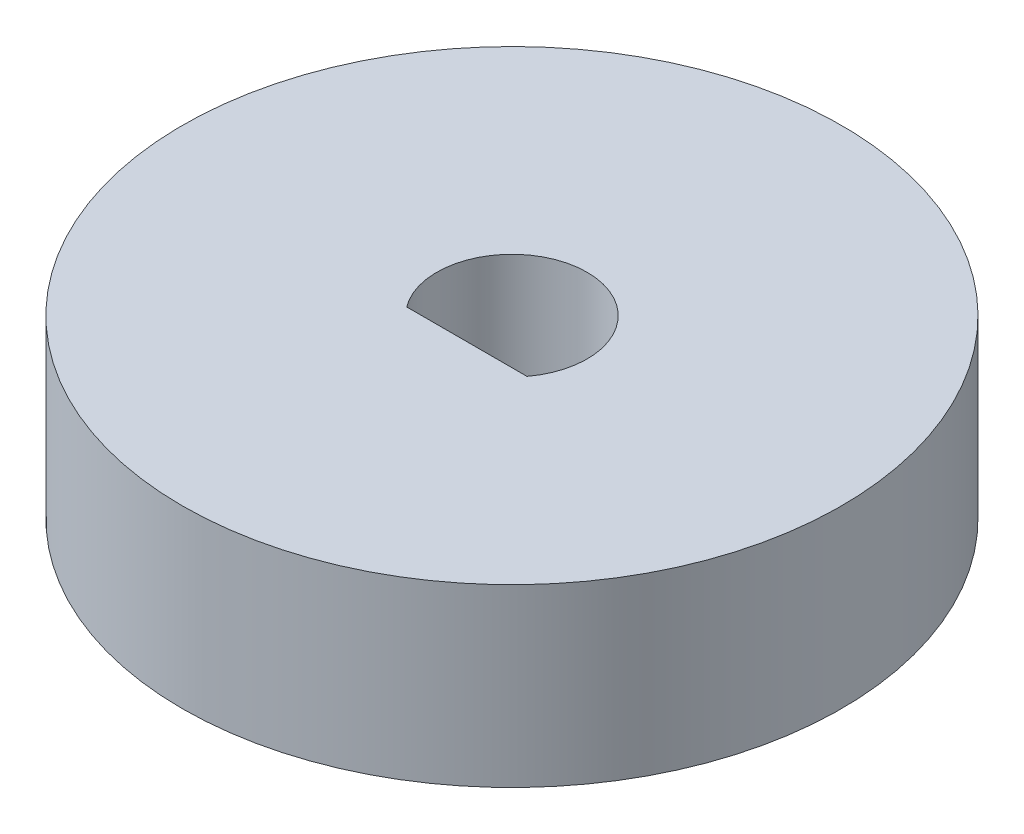
ISO-10303-21;
HEADER;
FILE_DESCRIPTION(('STEP AP214'),'2;1');
FILE_NAME('part.step','',(''),(''),'','','');
FILE_SCHEMA(('AUTOMOTIVE_DESIGN { 1 0 10303 214 1 1 1 1 }'));
ENDSEC;
DATA;
#1=APPLICATION_CONTEXT('core data for automotive mechanical design processes');
#2=APPLICATION_PROTOCOL_DEFINITION('international standard','automotive_design',2000,#1);
#3=PRODUCT_CONTEXT('',#1,'mechanical');
#4=PRODUCT('Part','Part','',(#3));
#5=PRODUCT_RELATED_PRODUCT_CATEGORY('part','',(#4));
#6=PRODUCT_DEFINITION_FORMATION('','',#4);
#7=PRODUCT_DEFINITION_CONTEXT('part definition',#1,'design');
#8=PRODUCT_DEFINITION('design','',#6,#7);
#9=PRODUCT_DEFINITION_SHAPE('','',#8);
#10=(LENGTH_UNIT() NAMED_UNIT(*) SI_UNIT(.MILLI.,.METRE.));
#11=(NAMED_UNIT(*) PLANE_ANGLE_UNIT() SI_UNIT($,.RADIAN.));
#12=(NAMED_UNIT(*) SI_UNIT($,.STERADIAN.) SOLID_ANGLE_UNIT());
#13=UNCERTAINTY_MEASURE_WITH_UNIT(LENGTH_MEASURE(1.E-05),#10,'distance_accuracy_value','');
#14=(GEOMETRIC_REPRESENTATION_CONTEXT(3) GLOBAL_UNCERTAINTY_ASSIGNED_CONTEXT((#13)) GLOBAL_UNIT_ASSIGNED_CONTEXT((#10,
#11,#12)) REPRESENTATION_CONTEXT('',''));
#15=CARTESIAN_POINT('',(0.,0.,0.));
#16=DIRECTION('',(0.,0.,1.));
#17=DIRECTION('',(1.,0.,0.));
#18=AXIS2_PLACEMENT_3D('',#15,#16,#17);
#19=CARTESIAN_POINT('',(0.,5.842,0.));
#20=DIRECTION('',(0.,-1.,0.));
#21=DIRECTION('',(0.,0.,-1.));
#22=AXIS2_PLACEMENT_3D('',#19,#20,#21);
#23=CYLINDRICAL_SURFACE('',#22,10.9601);
#24=CARTESIAN_POINT('',(0.,5.842,0.));
#25=DIRECTION('',(0.,1.,0.));
#26=DIRECTION('',(0.,0.,1.));
#27=AXIS2_PLACEMENT_3D('',#24,#25,#26);
#28=CIRCLE('',#27,10.9601);
#29=CARTESIAN_POINT('',(0.,5.842,10.9601));
#30=VERTEX_POINT('',#29);
#31=EDGE_CURVE('E11',#30,#30,#28,.T.);
#32=ORIENTED_EDGE('',*,*,#31,.F.);
#33=EDGE_LOOP('',(#32));
#34=FACE_BOUND('',#33,.T.);
#35=CARTESIAN_POINT('',(0.,0.,0.));
#36=DIRECTION('',(0.,1.,0.));
#37=DIRECTION('',(0.,0.,1.));
#38=AXIS2_PLACEMENT_3D('',#35,#36,#37);
#39=CIRCLE('',#38,10.9601);
#40=CARTESIAN_POINT('',(0.,0.,10.9601));
#41=VERTEX_POINT('',#40);
#42=EDGE_CURVE('E36',#41,#41,#39,.T.);
#43=ORIENTED_EDGE('',*,*,#42,.T.);
#44=EDGE_LOOP('',(#43));
#45=FACE_BOUND('',#44,.T.);
#46=ADVANCED_FACE('F33',(#34,#45),#23,.T.);
#47=CARTESIAN_POINT('',(0.,5.842,0.));
#48=DIRECTION('',(0.,1.,0.));
#49=DIRECTION('',(0.,0.,1.));
#50=AXIS2_PLACEMENT_3D('',#47,#48,#49);
#51=PLANE('',#50);
#52=CARTESIAN_POINT('',(0.,5.842,0.));
#53=DIRECTION('',(0.,1.,0.));
#54=DIRECTION('',(0.,0.,-1.));
#55=AXIS2_PLACEMENT_3D('',#52,#53,#54);
#56=CIRCLE('',#55,2.5);
#57=CARTESIAN_POINT('',(2.,5.842,1.5));
#58=VERTEX_POINT('',#57);
#59=CARTESIAN_POINT('',(-2.,5.842,1.5));
#60=VERTEX_POINT('',#59);
#61=EDGE_CURVE('E47',#58,#60,#56,.T.);
#62=ORIENTED_EDGE('',*,*,#61,.F.);
#63=DIRECTION('',(1.,0.,0.));
#64=VECTOR('',#63,1.);
#65=CARTESIAN_POINT('',(-2.,5.842,1.5));
#66=LINE('',#65,#64);
#67=EDGE_CURVE('E66',#60,#58,#66,.T.);
#68=ORIENTED_EDGE('',*,*,#67,.F.);
#69=EDGE_LOOP('',(#62,#68));
#70=FACE_BOUND('',#69,.T.);
#71=ORIENTED_EDGE('',*,*,#31,.T.);
#72=EDGE_LOOP('',(#71));
#73=FACE_BOUND('',#72,.T.);
#74=ADVANCED_FACE('F70',(#70,#73),#51,.T.);
#75=CARTESIAN_POINT('',(0.,0.,0.));
#76=DIRECTION('',(0.,1.,0.));
#77=DIRECTION('',(0.,0.,1.));
#78=AXIS2_PLACEMENT_3D('',#75,#76,#77);
#79=PLANE('',#78);
#80=DIRECTION('',(1.,0.,0.));
#81=VECTOR('',#80,1.);
#82=CARTESIAN_POINT('',(-2.,0.,1.5));
#83=LINE('',#82,#81);
#84=CARTESIAN_POINT('',(-2.,0.,1.5));
#85=VERTEX_POINT('',#84);
#86=CARTESIAN_POINT('',(2.,0.,1.5));
#87=VERTEX_POINT('',#86);
#88=EDGE_CURVE('E74',#85,#87,#83,.T.);
#89=ORIENTED_EDGE('',*,*,#88,.T.);
#90=CARTESIAN_POINT('',(0.,0.,0.));
#91=DIRECTION('',(0.,1.,0.));
#92=DIRECTION('',(0.,0.,-1.));
#93=AXIS2_PLACEMENT_3D('',#90,#91,#92);
#94=CIRCLE('',#93,2.5);
#95=EDGE_CURVE('E52',#87,#85,#94,.T.);
#96=ORIENTED_EDGE('',*,*,#95,.T.);
#97=EDGE_LOOP('',(#89,#96));
#98=FACE_BOUND('',#97,.T.);
#99=ORIENTED_EDGE('',*,*,#42,.F.);
#100=EDGE_LOOP('',(#99));
#101=FACE_BOUND('',#100,.T.);
#102=ADVANCED_FACE('F78',(#98,#101),#79,.F.);
#103=CARTESIAN_POINT('',(0.,0.,0.));
#104=DIRECTION('',(0.,1.,0.));
#105=DIRECTION('',(0.,0.,1.));
#106=AXIS2_PLACEMENT_3D('',#103,#104,#105);
#107=CYLINDRICAL_SURFACE('',#106,2.5);
#108=ORIENTED_EDGE('',*,*,#61,.T.);
#109=DIRECTION('',(0.,1.,0.));
#110=VECTOR('',#109,1.);
#111=CARTESIAN_POINT('',(-2.,0.,1.5));
#112=LINE('',#111,#110);
#113=EDGE_CURVE('E63',#85,#60,#112,.T.);
#114=ORIENTED_EDGE('',*,*,#113,.F.);
#115=ORIENTED_EDGE('',*,*,#95,.F.);
#116=DIRECTION('',(0.,1.,0.));
#117=VECTOR('',#116,1.);
#118=CARTESIAN_POINT('',(2.,0.,1.5));
#119=LINE('',#118,#117);
#120=EDGE_CURVE('E57',#87,#58,#119,.T.);
#121=ORIENTED_EDGE('',*,*,#120,.T.);
#122=EDGE_LOOP('',(#108,#114,#115,#121));
#123=FACE_BOUND('',#122,.T.);
#124=ADVANCED_FACE('F59',(#123),#107,.F.);
#125=CARTESIAN_POINT('',(-2.,0.,1.5));
#126=DIRECTION('',(0.,0.,1.));
#127=DIRECTION('',(1.,0.,0.));
#128=AXIS2_PLACEMENT_3D('',#125,#126,#127);
#129=PLANE('',#128);
#130=ORIENTED_EDGE('',*,*,#67,.T.);
#131=ORIENTED_EDGE('',*,*,#120,.F.);
#132=ORIENTED_EDGE('',*,*,#88,.F.);
#133=ORIENTED_EDGE('',*,*,#113,.T.);
#134=EDGE_LOOP('',(#130,#131,#132,#133));
#135=FACE_BOUND('',#134,.T.);
#136=ADVANCED_FACE('F67',(#135),#129,.F.);
#137=CLOSED_SHELL('',(#46,#74,#102,#124,#136));
#138=MANIFOLD_SOLID_BREP('B2',#137);
#139=ADVANCED_BREP_SHAPE_REPRESENTATION('',(#18,#138),#14);
#140=SHAPE_DEFINITION_REPRESENTATION(#9,#139);
ENDSEC;
END-ISO-10303-21;
